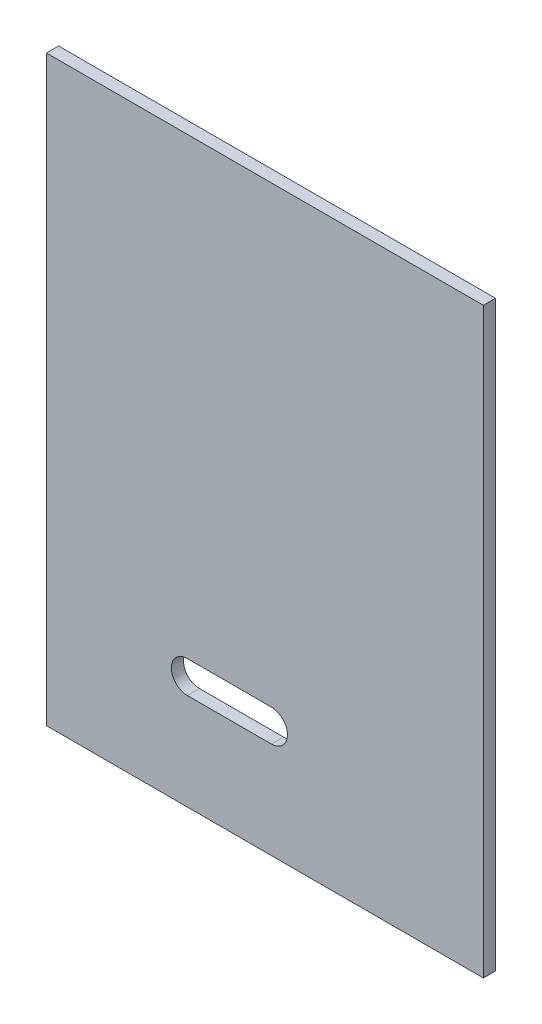
ISO-10303-21;
HEADER;
FILE_DESCRIPTION(('STEP AP214'),'2;1');
FILE_NAME('part.step','',(''),(''),'','','');
FILE_SCHEMA(('AUTOMOTIVE_DESIGN { 1 0 10303 214 1 1 1 1 }'));
ENDSEC;
DATA;
#1=APPLICATION_CONTEXT('core data for automotive mechanical design processes');
#2=APPLICATION_PROTOCOL_DEFINITION('international standard','automotive_design',2000,#1);
#3=PRODUCT_CONTEXT('',#1,'mechanical');
#4=PRODUCT('Part','Part','',(#3));
#5=PRODUCT_RELATED_PRODUCT_CATEGORY('part','',(#4));
#6=PRODUCT_DEFINITION_FORMATION('','',#4);
#7=PRODUCT_DEFINITION_CONTEXT('part definition',#1,'design');
#8=PRODUCT_DEFINITION('design','',#6,#7);
#9=PRODUCT_DEFINITION_SHAPE('','',#8);
#10=(LENGTH_UNIT() NAMED_UNIT(*) SI_UNIT(.MILLI.,.METRE.));
#11=(NAMED_UNIT(*) PLANE_ANGLE_UNIT() SI_UNIT($,.RADIAN.));
#12=(NAMED_UNIT(*) SI_UNIT($,.STERADIAN.) SOLID_ANGLE_UNIT());
#13=UNCERTAINTY_MEASURE_WITH_UNIT(LENGTH_MEASURE(1.E-05),#10,'distance_accuracy_value','');
#14=(GEOMETRIC_REPRESENTATION_CONTEXT(3) GLOBAL_UNCERTAINTY_ASSIGNED_CONTEXT((#13)) GLOBAL_UNIT_ASSIGNED_CONTEXT((#10,
#11,#12)) REPRESENTATION_CONTEXT('',''));
#15=CARTESIAN_POINT('',(0.,0.,0.));
#16=DIRECTION('',(0.,0.,1.));
#17=DIRECTION('',(1.,0.,0.));
#18=AXIS2_PLACEMENT_3D('',#15,#16,#17);
#19=CARTESIAN_POINT('',(228.6,304.8,6.35));
#20=DIRECTION('',(-1.,0.,0.));
#21=DIRECTION('',(0.,-1.,0.));
#22=AXIS2_PLACEMENT_3D('',#19,#20,#21);
#23=PLANE('',#22);
#24=DIRECTION('',(0.,1.,0.));
#25=VECTOR('',#24,1.);
#26=CARTESIAN_POINT('',(228.6,304.8,0.));
#27=LINE('',#26,#25);
#28=CARTESIAN_POINT('',(228.6,0.,0.));
#29=VERTEX_POINT('',#28);
#30=CARTESIAN_POINT('',(228.6,304.8,0.));
#31=VERTEX_POINT('',#30);
#32=EDGE_CURVE('E130',#29,#31,#27,.T.);
#33=ORIENTED_EDGE('',*,*,#32,.T.);
#34=DIRECTION('',(0.,0.,-1.));
#35=VECTOR('',#34,1.);
#36=CARTESIAN_POINT('',(228.6,304.8,6.35));
#37=LINE('',#36,#35);
#38=CARTESIAN_POINT('',(228.6,304.8,6.35));
#39=VERTEX_POINT('',#38);
#40=EDGE_CURVE('E11',#39,#31,#37,.T.);
#41=ORIENTED_EDGE('',*,*,#40,.F.);
#42=DIRECTION('',(0.,1.,0.));
#43=VECTOR('',#42,1.);
#44=CARTESIAN_POINT('',(228.6,304.8,6.35));
#45=LINE('',#44,#43);
#46=CARTESIAN_POINT('',(228.6,0.,6.35));
#47=VERTEX_POINT('',#46);
#48=EDGE_CURVE('E134',#47,#39,#45,.T.);
#49=ORIENTED_EDGE('',*,*,#48,.F.);
#50=DIRECTION('',(0.,0.,-1.));
#51=VECTOR('',#50,1.);
#52=CARTESIAN_POINT('',(228.6,0.,6.35));
#53=LINE('',#52,#51);
#54=EDGE_CURVE('E144',#47,#29,#53,.T.);
#55=ORIENTED_EDGE('',*,*,#54,.T.);
#56=EDGE_LOOP('',(#33,#41,#49,#55));
#57=FACE_BOUND('',#56,.T.);
#58=ADVANCED_FACE('F33',(#57),#23,.F.);
#59=CARTESIAN_POINT('',(0.,304.8,6.35));
#60=DIRECTION('',(0.,-1.,0.));
#61=DIRECTION('',(0.,0.,-1.));
#62=AXIS2_PLACEMENT_3D('',#59,#60,#61);
#63=PLANE('',#62);
#64=DIRECTION('',(-1.,0.,0.));
#65=VECTOR('',#64,1.);
#66=CARTESIAN_POINT('',(0.,304.8,0.));
#67=LINE('',#66,#65);
#68=CARTESIAN_POINT('',(0.,304.8,0.));
#69=VERTEX_POINT('',#68);
#70=EDGE_CURVE('E147',#31,#69,#67,.T.);
#71=ORIENTED_EDGE('',*,*,#70,.T.);
#72=DIRECTION('',(0.,0.,-1.));
#73=VECTOR('',#72,1.);
#74=CARTESIAN_POINT('',(0.,304.8,6.35));
#75=LINE('',#74,#73);
#76=CARTESIAN_POINT('',(0.,304.8,6.35));
#77=VERTEX_POINT('',#76);
#78=EDGE_CURVE('E40',#77,#69,#75,.T.);
#79=ORIENTED_EDGE('',*,*,#78,.F.);
#80=DIRECTION('',(-1.,0.,0.));
#81=VECTOR('',#80,1.);
#82=CARTESIAN_POINT('',(0.,304.8,6.35));
#83=LINE('',#82,#81);
#84=EDGE_CURVE('E137',#39,#77,#83,.T.);
#85=ORIENTED_EDGE('',*,*,#84,.F.);
#86=ORIENTED_EDGE('',*,*,#40,.T.);
#87=EDGE_LOOP('',(#71,#79,#85,#86));
#88=FACE_BOUND('',#87,.T.);
#89=ADVANCED_FACE('F175',(#88),#63,.F.);
#90=CARTESIAN_POINT('',(0.,0.,6.35));
#91=DIRECTION('',(1.,0.,0.));
#92=DIRECTION('',(0.,0.,-1.));
#93=AXIS2_PLACEMENT_3D('',#90,#91,#92);
#94=PLANE('',#93);
#95=DIRECTION('',(0.,-1.,0.));
#96=VECTOR('',#95,1.);
#97=CARTESIAN_POINT('',(0.,0.,0.));
#98=LINE('',#97,#96);
#99=CARTESIAN_POINT('',(0.,0.,0.));
#100=VERTEX_POINT('',#99);
#101=EDGE_CURVE('E149',#69,#100,#98,.T.);
#102=ORIENTED_EDGE('',*,*,#101,.T.);
#103=DIRECTION('',(0.,0.,-1.));
#104=VECTOR('',#103,1.);
#105=CARTESIAN_POINT('',(0.,0.,6.35));
#106=LINE('',#105,#104);
#107=CARTESIAN_POINT('',(0.,0.,6.35));
#108=VERTEX_POINT('',#107);
#109=EDGE_CURVE('E154',#108,#100,#106,.T.);
#110=ORIENTED_EDGE('',*,*,#109,.F.);
#111=DIRECTION('',(0.,-1.,0.));
#112=VECTOR('',#111,1.);
#113=CARTESIAN_POINT('',(0.,0.,6.35));
#114=LINE('',#113,#112);
#115=EDGE_CURVE('E140',#77,#108,#114,.T.);
#116=ORIENTED_EDGE('',*,*,#115,.F.);
#117=ORIENTED_EDGE('',*,*,#78,.T.);
#118=EDGE_LOOP('',(#102,#110,#116,#117));
#119=FACE_BOUND('',#118,.T.);
#120=ADVANCED_FACE('F161',(#119),#94,.F.);
#121=CARTESIAN_POINT('',(228.6,0.,6.35));
#122=DIRECTION('',(0.,1.,0.));
#123=DIRECTION('',(-1.,0.,0.));
#124=AXIS2_PLACEMENT_3D('',#121,#122,#123);
#125=PLANE('',#124);
#126=DIRECTION('',(1.,0.,0.));
#127=VECTOR('',#126,1.);
#128=CARTESIAN_POINT('',(228.6,0.,0.));
#129=LINE('',#128,#127);
#130=EDGE_CURVE('E138',#100,#29,#129,.T.);
#131=ORIENTED_EDGE('',*,*,#130,.T.);
#132=ORIENTED_EDGE('',*,*,#54,.F.);
#133=DIRECTION('',(1.,0.,0.));
#134=VECTOR('',#133,1.);
#135=CARTESIAN_POINT('',(228.6,0.,6.35));
#136=LINE('',#135,#134);
#137=EDGE_CURVE('E142',#108,#47,#136,.T.);
#138=ORIENTED_EDGE('',*,*,#137,.F.);
#139=ORIENTED_EDGE('',*,*,#109,.T.);
#140=EDGE_LOOP('',(#131,#132,#138,#139));
#141=FACE_BOUND('',#140,.T.);
#142=ADVANCED_FACE('F168',(#141),#125,.F.);
#143=CARTESIAN_POINT('',(0.,0.,6.35));
#144=DIRECTION('',(0.,0.,-1.));
#145=DIRECTION('',(-1.,0.,0.));
#146=AXIS2_PLACEMENT_3D('',#143,#144,#145);
#147=PLANE('',#146);
#148=DIRECTION('',(1.,0.,0.));
#149=VECTOR('',#148,1.);
#150=CARTESIAN_POINT('',(73.7049487612246,50.5392313372018,6.35));
#151=LINE('',#150,#149);
#152=CARTESIAN_POINT('',(73.7049487612246,50.5392313372018,6.35));
#153=VERTEX_POINT('',#152);
#154=CARTESIAN_POINT('',(117.706772468533,50.5392313372018,6.35));
#155=VERTEX_POINT('',#154);
#156=EDGE_CURVE('E124',#153,#155,#151,.T.);
#157=ORIENTED_EDGE('',*,*,#156,.F.);
#158=CARTESIAN_POINT('',(73.7049487612246,58.9083664495083,6.35));
#159=DIRECTION('',(0.,0.,1.));
#160=DIRECTION('',(1.,0.,0.));
#161=AXIS2_PLACEMENT_3D('',#158,#159,#160);
#162=CIRCLE('',#161,8.36913511230657);
#163=CARTESIAN_POINT('',(73.7049487612246,67.2775015618149,6.35));
#164=VERTEX_POINT('',#163);
#165=EDGE_CURVE('E47',#164,#153,#162,.T.);
#166=ORIENTED_EDGE('',*,*,#165,.F.);
#167=DIRECTION('',(-1.,0.,0.));
#168=VECTOR('',#167,1.);
#169=CARTESIAN_POINT('',(73.7049487612246,67.2775015618149,6.35));
#170=LINE('',#169,#168);
#171=CARTESIAN_POINT('',(117.706772468533,67.2775015618149,6.35));
#172=VERTEX_POINT('',#171);
#173=EDGE_CURVE('E115',#172,#164,#170,.T.);
#174=ORIENTED_EDGE('',*,*,#173,.F.);
#175=CARTESIAN_POINT('',(117.706772468533,58.9083664495083,6.35));
#176=DIRECTION('',(0.,0.,1.));
#177=DIRECTION('',(1.,0.,0.));
#178=AXIS2_PLACEMENT_3D('',#175,#176,#177);
#179=CIRCLE('',#178,8.36913511230657);
#180=EDGE_CURVE('E118',#155,#172,#179,.T.);
#181=ORIENTED_EDGE('',*,*,#180,.F.);
#182=EDGE_LOOP('',(#157,#166,#174,#181));
#183=FACE_BOUND('',#182,.T.);
#184=ORIENTED_EDGE('',*,*,#48,.T.);
#185=ORIENTED_EDGE('',*,*,#84,.T.);
#186=ORIENTED_EDGE('',*,*,#115,.T.);
#187=ORIENTED_EDGE('',*,*,#137,.T.);
#188=EDGE_LOOP('',(#184,#185,#186,#187));
#189=FACE_BOUND('',#188,.T.);
#190=ADVANCED_FACE('F174',(#183,#189),#147,.F.);
#191=CARTESIAN_POINT('',(0.,0.,0.));
#192=DIRECTION('',(0.,0.,-1.));
#193=DIRECTION('',(-1.,0.,0.));
#194=AXIS2_PLACEMENT_3D('',#191,#192,#193);
#195=PLANE('',#194);
#196=CARTESIAN_POINT('',(73.7049487612246,58.9083664495083,0.));
#197=DIRECTION('',(0.,0.,1.));
#198=DIRECTION('',(1.,0.,0.));
#199=AXIS2_PLACEMENT_3D('',#196,#197,#198);
#200=CIRCLE('',#199,8.36913511230657);
#201=CARTESIAN_POINT('',(73.7049487612246,67.2775015618149,0.));
#202=VERTEX_POINT('',#201);
#203=CARTESIAN_POINT('',(73.7049487612246,50.5392313372018,0.));
#204=VERTEX_POINT('',#203);
#205=EDGE_CURVE('E99',#202,#204,#200,.T.);
#206=ORIENTED_EDGE('',*,*,#205,.T.);
#207=DIRECTION('',(1.,0.,0.));
#208=VECTOR('',#207,1.);
#209=CARTESIAN_POINT('',(73.7049487612246,50.5392313372018,0.));
#210=LINE('',#209,#208);
#211=CARTESIAN_POINT('',(117.706772468533,50.5392313372018,0.));
#212=VERTEX_POINT('',#211);
#213=EDGE_CURVE('E108',#204,#212,#210,.T.);
#214=ORIENTED_EDGE('',*,*,#213,.T.);
#215=CARTESIAN_POINT('',(117.706772468533,58.9083664495083,0.));
#216=DIRECTION('',(0.,0.,1.));
#217=DIRECTION('',(1.,0.,0.));
#218=AXIS2_PLACEMENT_3D('',#215,#216,#217);
#219=CIRCLE('',#218,8.36913511230657);
#220=CARTESIAN_POINT('',(117.706772468533,67.2775015618149,0.));
#221=VERTEX_POINT('',#220);
#222=EDGE_CURVE('E55',#212,#221,#219,.T.);
#223=ORIENTED_EDGE('',*,*,#222,.T.);
#224=DIRECTION('',(-1.,0.,0.));
#225=VECTOR('',#224,1.);
#226=CARTESIAN_POINT('',(73.7049487612246,67.2775015618149,0.));
#227=LINE('',#226,#225);
#228=EDGE_CURVE('E105',#221,#202,#227,.T.);
#229=ORIENTED_EDGE('',*,*,#228,.T.);
#230=EDGE_LOOP('',(#206,#214,#223,#229));
#231=FACE_BOUND('',#230,.T.);
#232=ORIENTED_EDGE('',*,*,#32,.F.);
#233=ORIENTED_EDGE('',*,*,#130,.F.);
#234=ORIENTED_EDGE('',*,*,#101,.F.);
#235=ORIENTED_EDGE('',*,*,#70,.F.);
#236=EDGE_LOOP('',(#232,#233,#234,#235));
#237=FACE_BOUND('',#236,.T.);
#238=ADVANCED_FACE('F112',(#231,#237),#195,.T.);
#239=CARTESIAN_POINT('',(73.7049487612246,58.9083664495083,0.));
#240=DIRECTION('',(0.,0.,1.));
#241=DIRECTION('',(1.,0.,0.));
#242=AXIS2_PLACEMENT_3D('',#239,#240,#241);
#243=CYLINDRICAL_SURFACE('',#242,8.36913511230657);
#244=ORIENTED_EDGE('',*,*,#165,.T.);
#245=DIRECTION('',(0.,0.,1.));
#246=VECTOR('',#245,1.);
#247=CARTESIAN_POINT('',(73.7049487612246,50.5392313372018,0.));
#248=LINE('',#247,#246);
#249=EDGE_CURVE('E95',#204,#153,#248,.T.);
#250=ORIENTED_EDGE('',*,*,#249,.F.);
#251=ORIENTED_EDGE('',*,*,#205,.F.);
#252=DIRECTION('',(0.,0.,1.));
#253=VECTOR('',#252,1.);
#254=CARTESIAN_POINT('',(73.7049487612246,67.2775015618149,0.));
#255=LINE('',#254,#253);
#256=EDGE_CURVE('E128',#202,#164,#255,.T.);
#257=ORIENTED_EDGE('',*,*,#256,.T.);
#258=EDGE_LOOP('',(#244,#250,#251,#257));
#259=FACE_BOUND('',#258,.T.);
#260=ADVANCED_FACE('F97',(#259),#243,.F.);
#261=CARTESIAN_POINT('',(73.7049487612246,67.2775015618149,0.));
#262=DIRECTION('',(0.,1.,0.));
#263=DIRECTION('',(0.,0.,1.));
#264=AXIS2_PLACEMENT_3D('',#261,#262,#263);
#265=PLANE('',#264);
#266=ORIENTED_EDGE('',*,*,#173,.T.);
#267=ORIENTED_EDGE('',*,*,#256,.F.);
#268=ORIENTED_EDGE('',*,*,#228,.F.);
#269=DIRECTION('',(0.,0.,1.));
#270=VECTOR('',#269,1.);
#271=CARTESIAN_POINT('',(117.706772468533,67.2775015618149,0.));
#272=LINE('',#271,#270);
#273=EDGE_CURVE('E131',#221,#172,#272,.T.);
#274=ORIENTED_EDGE('',*,*,#273,.T.);
#275=EDGE_LOOP('',(#266,#267,#268,#274));
#276=FACE_BOUND('',#275,.T.);
#277=ADVANCED_FACE('F192',(#276),#265,.F.);
#278=CARTESIAN_POINT('',(117.706772468533,58.9083664495083,0.));
#279=DIRECTION('',(0.,0.,1.));
#280=DIRECTION('',(1.,0.,0.));
#281=AXIS2_PLACEMENT_3D('',#278,#279,#280);
#282=CYLINDRICAL_SURFACE('',#281,8.36913511230657);
#283=ORIENTED_EDGE('',*,*,#180,.T.);
#284=ORIENTED_EDGE('',*,*,#273,.F.);
#285=ORIENTED_EDGE('',*,*,#222,.F.);
#286=DIRECTION('',(0.,0.,1.));
#287=VECTOR('',#286,1.);
#288=CARTESIAN_POINT('',(117.706772468533,50.5392313372018,0.));
#289=LINE('',#288,#287);
#290=EDGE_CURVE('E104',#212,#155,#289,.T.);
#291=ORIENTED_EDGE('',*,*,#290,.T.);
#292=EDGE_LOOP('',(#283,#284,#285,#291));
#293=FACE_BOUND('',#292,.T.);
#294=ADVANCED_FACE('F195',(#293),#282,.F.);
#295=CARTESIAN_POINT('',(73.7049487612246,50.5392313372018,0.));
#296=DIRECTION('',(0.,-1.,0.));
#297=DIRECTION('',(0.,0.,-1.));
#298=AXIS2_PLACEMENT_3D('',#295,#296,#297);
#299=PLANE('',#298);
#300=ORIENTED_EDGE('',*,*,#156,.T.);
#301=ORIENTED_EDGE('',*,*,#290,.F.);
#302=ORIENTED_EDGE('',*,*,#213,.F.);
#303=ORIENTED_EDGE('',*,*,#249,.T.);
#304=EDGE_LOOP('',(#300,#301,#302,#303));
#305=FACE_BOUND('',#304,.T.);
#306=ADVANCED_FACE('F109',(#305),#299,.F.);
#307=CLOSED_SHELL('',(#58,#89,#120,#142,#190,#238,#260,#277,#294,#306));
#308=MANIFOLD_SOLID_BREP('B2',#307);
#309=ADVANCED_BREP_SHAPE_REPRESENTATION('',(#18,#308),#14);
#310=SHAPE_DEFINITION_REPRESENTATION(#9,#309);
ENDSEC;
END-ISO-10303-21;
